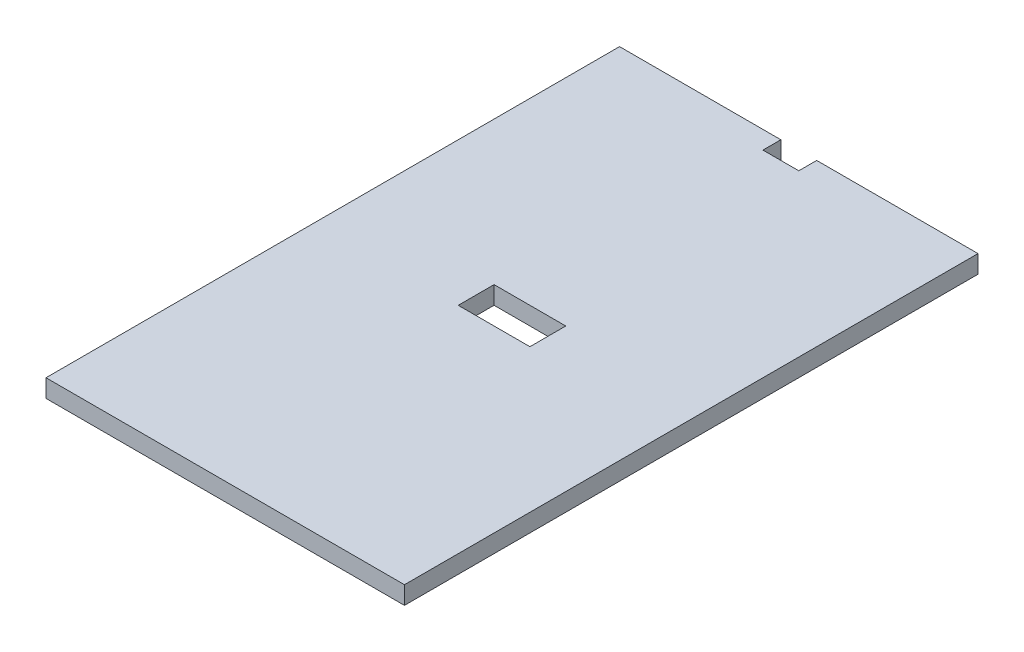
ISO-10303-21;
HEADER;
FILE_DESCRIPTION(('STEP AP214'),'2;1');
FILE_NAME('part.step','',(''),(''),'','','');
FILE_SCHEMA(('AUTOMOTIVE_DESIGN { 1 0 10303 214 1 1 1 1 }'));
ENDSEC;
DATA;
#1=APPLICATION_CONTEXT('core data for automotive mechanical design processes');
#2=APPLICATION_PROTOCOL_DEFINITION('international standard','automotive_design',2000,#1);
#3=PRODUCT_CONTEXT('',#1,'mechanical');
#4=PRODUCT('Part','Part','',(#3));
#5=PRODUCT_RELATED_PRODUCT_CATEGORY('part','',(#4));
#6=PRODUCT_DEFINITION_FORMATION('','',#4);
#7=PRODUCT_DEFINITION_CONTEXT('part definition',#1,'design');
#8=PRODUCT_DEFINITION('design','',#6,#7);
#9=PRODUCT_DEFINITION_SHAPE('','',#8);
#10=(LENGTH_UNIT() NAMED_UNIT(*) SI_UNIT(.MILLI.,.METRE.));
#11=(NAMED_UNIT(*) PLANE_ANGLE_UNIT() SI_UNIT($,.RADIAN.));
#12=(NAMED_UNIT(*) SI_UNIT($,.STERADIAN.) SOLID_ANGLE_UNIT());
#13=UNCERTAINTY_MEASURE_WITH_UNIT(LENGTH_MEASURE(1.E-05),#10,'distance_accuracy_value','');
#14=(GEOMETRIC_REPRESENTATION_CONTEXT(3) GLOBAL_UNCERTAINTY_ASSIGNED_CONTEXT((#13)) GLOBAL_UNIT_ASSIGNED_CONTEXT((#10,
#11,#12)) REPRESENTATION_CONTEXT('',''));
#15=CARTESIAN_POINT('',(0.,0.,0.));
#16=DIRECTION('',(0.,0.,1.));
#17=DIRECTION('',(1.,0.,0.));
#18=AXIS2_PLACEMENT_3D('',#15,#16,#17);
#19=CARTESIAN_POINT('',(50.,5.,-80.));
#20=DIRECTION('',(0.,0.,1.));
#21=DIRECTION('',(1.,0.,0.));
#22=AXIS2_PLACEMENT_3D('',#19,#20,#21);
#23=PLANE('',#22);
#24=DIRECTION('',(-1.,0.,0.));
#25=VECTOR('',#24,1.);
#26=CARTESIAN_POINT('',(50.,5.,-80.));
#27=LINE('',#26,#25);
#28=CARTESIAN_POINT('',(-5.,5.,-80.));
#29=VERTEX_POINT('',#28);
#30=CARTESIAN_POINT('',(-50.,5.,-80.));
#31=VERTEX_POINT('',#30);
#32=EDGE_CURVE('E197',#29,#31,#27,.T.);
#33=ORIENTED_EDGE('',*,*,#32,.F.);
#34=DIRECTION('',(0.,1.,0.));
#35=VECTOR('',#34,1.);
#36=CARTESIAN_POINT('',(-5.,0.,-80.));
#37=LINE('',#36,#35);
#38=CARTESIAN_POINT('',(-5.,0.,-80.));
#39=VERTEX_POINT('',#38);
#40=EDGE_CURVE('E154',#39,#29,#37,.T.);
#41=ORIENTED_EDGE('',*,*,#40,.F.);
#42=DIRECTION('',(-1.,0.,0.));
#43=VECTOR('',#42,1.);
#44=CARTESIAN_POINT('',(50.,0.,-80.));
#45=LINE('',#44,#43);
#46=CARTESIAN_POINT('',(-50.,0.,-80.));
#47=VERTEX_POINT('',#46);
#48=EDGE_CURVE('E146',#39,#47,#45,.T.);
#49=ORIENTED_EDGE('',*,*,#48,.T.);
#50=DIRECTION('',(0.,-1.,0.));
#51=VECTOR('',#50,1.);
#52=CARTESIAN_POINT('',(-50.,5.,-80.));
#53=LINE('',#52,#51);
#54=EDGE_CURVE('E201',#31,#47,#53,.T.);
#55=ORIENTED_EDGE('',*,*,#54,.F.);
#56=EDGE_LOOP('',(#33,#41,#49,#55));
#57=FACE_BOUND('',#56,.T.);
#58=ADVANCED_FACE('F33',(#57),#23,.F.);
#59=CARTESIAN_POINT('',(0.,5.,0.));
#60=DIRECTION('',(0.,-1.,0.));
#61=DIRECTION('',(0.,0.,-1.));
#62=AXIS2_PLACEMENT_3D('',#59,#60,#61);
#63=PLANE('',#62);
#64=DIRECTION('',(1.,0.,0.));
#65=VECTOR('',#64,1.);
#66=CARTESIAN_POINT('',(-5.,5.,-75.));
#67=LINE('',#66,#65);
#68=CARTESIAN_POINT('',(-5.,5.,-75.));
#69=VERTEX_POINT('',#68);
#70=CARTESIAN_POINT('',(5.,5.,-75.));
#71=VERTEX_POINT('',#70);
#72=EDGE_CURVE('E148',#69,#71,#67,.T.);
#73=ORIENTED_EDGE('',*,*,#72,.F.);
#74=DIRECTION('',(0.,0.,1.));
#75=VECTOR('',#74,1.);
#76=CARTESIAN_POINT('',(-5.,5.,-80.));
#77=LINE('',#76,#75);
#78=EDGE_CURVE('E128',#29,#69,#77,.T.);
#79=ORIENTED_EDGE('',*,*,#78,.F.);
#80=ORIENTED_EDGE('',*,*,#32,.T.);
#81=DIRECTION('',(0.,0.,1.));
#82=VECTOR('',#81,1.);
#83=CARTESIAN_POINT('',(-50.,5.,-80.));
#84=LINE('',#83,#82);
#85=CARTESIAN_POINT('',(-50.,5.,80.));
#86=VERTEX_POINT('',#85);
#87=EDGE_CURVE('E189',#31,#86,#84,.T.);
#88=ORIENTED_EDGE('',*,*,#87,.T.);
#89=DIRECTION('',(1.,0.,0.));
#90=VECTOR('',#89,1.);
#91=CARTESIAN_POINT('',(50.,5.,80.));
#92=LINE('',#91,#90);
#93=CARTESIAN_POINT('',(50.,5.,80.));
#94=VERTEX_POINT('',#93);
#95=EDGE_CURVE('E192',#86,#94,#92,.T.);
#96=ORIENTED_EDGE('',*,*,#95,.T.);
#97=DIRECTION('',(0.,0.,-1.));
#98=VECTOR('',#97,1.);
#99=CARTESIAN_POINT('',(50.,5.,-80.));
#100=LINE('',#99,#98);
#101=CARTESIAN_POINT('',(50.,5.,-80.));
#102=VERTEX_POINT('',#101);
#103=EDGE_CURVE('E195',#94,#102,#100,.T.);
#104=ORIENTED_EDGE('',*,*,#103,.T.);
#105=CARTESIAN_POINT('',(5.,5.,-80.));
#106=VERTEX_POINT('',#105);
#107=EDGE_CURVE('E198',#102,#106,#27,.T.);
#108=ORIENTED_EDGE('',*,*,#107,.T.);
#109=DIRECTION('',(0.,0.,-1.));
#110=VECTOR('',#109,1.);
#111=CARTESIAN_POINT('',(5.,5.,-80.));
#112=LINE('',#111,#110);
#113=EDGE_CURVE('E48',#71,#106,#112,.T.);
#114=ORIENTED_EDGE('',*,*,#113,.F.);
#115=EDGE_LOOP('',(#73,#79,#80,#88,#96,#104,#108,#114));
#116=FACE_BOUND('',#115,.T.);
#117=DIRECTION('',(0.,0.,-1.));
#118=VECTOR('',#117,1.);
#119=CARTESIAN_POINT('',(10.,5.,5.00000000000002));
#120=LINE('',#119,#118);
#121=CARTESIAN_POINT('',(10.,5.,5.00000000000002));
#122=VERTEX_POINT('',#121);
#123=CARTESIAN_POINT('',(10.,5.,-4.99999999999998));
#124=VERTEX_POINT('',#123);
#125=EDGE_CURVE('E160',#122,#124,#120,.T.);
#126=ORIENTED_EDGE('',*,*,#125,.F.);
#127=DIRECTION('',(1.,0.,0.));
#128=VECTOR('',#127,1.);
#129=CARTESIAN_POINT('',(-10.,5.,5.00000000000002));
#130=LINE('',#129,#128);
#131=CARTESIAN_POINT('',(-10.,5.,5.00000000000002));
#132=VERTEX_POINT('',#131);
#133=EDGE_CURVE('E167',#132,#122,#130,.T.);
#134=ORIENTED_EDGE('',*,*,#133,.F.);
#135=DIRECTION('',(0.,0.,1.));
#136=VECTOR('',#135,1.);
#137=CARTESIAN_POINT('',(-10.,5.,5.00000000000002));
#138=LINE('',#137,#136);
#139=CARTESIAN_POINT('',(-10.,5.,-4.99999999999998));
#140=VERTEX_POINT('',#139);
#141=EDGE_CURVE('E165',#140,#132,#138,.T.);
#142=ORIENTED_EDGE('',*,*,#141,.F.);
#143=DIRECTION('',(-1.,0.,0.));
#144=VECTOR('',#143,1.);
#145=CARTESIAN_POINT('',(-10.,5.,-4.99999999999998));
#146=LINE('',#145,#144);
#147=EDGE_CURVE('E162',#124,#140,#146,.T.);
#148=ORIENTED_EDGE('',*,*,#147,.F.);
#149=EDGE_LOOP('',(#126,#134,#142,#148));
#150=FACE_BOUND('',#149,.T.);
#151=ADVANCED_FACE('F227',(#116,#150),#63,.F.);
#152=CARTESIAN_POINT('',(0.,0.,0.));
#153=DIRECTION('',(0.,-1.,0.));
#154=DIRECTION('',(0.,0.,-1.));
#155=AXIS2_PLACEMENT_3D('',#152,#153,#154);
#156=PLANE('',#155);
#157=DIRECTION('',(0.,0.,1.));
#158=VECTOR('',#157,1.);
#159=CARTESIAN_POINT('',(-5.,0.,-80.));
#160=LINE('',#159,#158);
#161=CARTESIAN_POINT('',(-5.,0.,-75.));
#162=VERTEX_POINT('',#161);
#163=EDGE_CURVE('E125',#39,#162,#160,.T.);
#164=ORIENTED_EDGE('',*,*,#163,.T.);
#165=DIRECTION('',(1.,0.,0.));
#166=VECTOR('',#165,1.);
#167=CARTESIAN_POINT('',(-5.,0.,-75.));
#168=LINE('',#167,#166);
#169=CARTESIAN_POINT('',(5.,0.,-75.));
#170=VERTEX_POINT('',#169);
#171=EDGE_CURVE('E136',#162,#170,#168,.T.);
#172=ORIENTED_EDGE('',*,*,#171,.T.);
#173=DIRECTION('',(0.,0.,-1.));
#174=VECTOR('',#173,1.);
#175=CARTESIAN_POINT('',(5.,0.,-80.));
#176=LINE('',#175,#174);
#177=CARTESIAN_POINT('',(5.,0.,-80.));
#178=VERTEX_POINT('',#177);
#179=EDGE_CURVE('E133',#170,#178,#176,.T.);
#180=ORIENTED_EDGE('',*,*,#179,.T.);
#181=CARTESIAN_POINT('',(50.,0.,-80.));
#182=VERTEX_POINT('',#181);
#183=EDGE_CURVE('E193',#182,#178,#45,.T.);
#184=ORIENTED_EDGE('',*,*,#183,.F.);
#185=DIRECTION('',(0.,0.,-1.));
#186=VECTOR('',#185,1.);
#187=CARTESIAN_POINT('',(50.,0.,-80.));
#188=LINE('',#187,#186);
#189=CARTESIAN_POINT('',(50.,0.,80.));
#190=VERTEX_POINT('',#189);
#191=EDGE_CURVE('E206',#190,#182,#188,.T.);
#192=ORIENTED_EDGE('',*,*,#191,.F.);
#193=DIRECTION('',(1.,0.,0.));
#194=VECTOR('',#193,1.);
#195=CARTESIAN_POINT('',(50.,0.,80.));
#196=LINE('',#195,#194);
#197=CARTESIAN_POINT('',(-50.,0.,80.));
#198=VERTEX_POINT('',#197);
#199=EDGE_CURVE('E204',#198,#190,#196,.T.);
#200=ORIENTED_EDGE('',*,*,#199,.F.);
#201=DIRECTION('',(0.,0.,1.));
#202=VECTOR('',#201,1.);
#203=CARTESIAN_POINT('',(-50.,0.,-80.));
#204=LINE('',#203,#202);
#205=EDGE_CURVE('E188',#47,#198,#204,.T.);
#206=ORIENTED_EDGE('',*,*,#205,.F.);
#207=ORIENTED_EDGE('',*,*,#48,.F.);
#208=EDGE_LOOP('',(#164,#172,#180,#184,#192,#200,#206,#207));
#209=FACE_BOUND('',#208,.T.);
#210=DIRECTION('',(1.,0.,0.));
#211=VECTOR('',#210,1.);
#212=CARTESIAN_POINT('',(-10.,0.,5.00000000000002));
#213=LINE('',#212,#211);
#214=CARTESIAN_POINT('',(-10.,0.,5.00000000000002));
#215=VERTEX_POINT('',#214);
#216=CARTESIAN_POINT('',(10.,0.,5.00000000000002));
#217=VERTEX_POINT('',#216);
#218=EDGE_CURVE('E163',#215,#217,#213,.T.);
#219=ORIENTED_EDGE('',*,*,#218,.T.);
#220=DIRECTION('',(0.,0.,-1.));
#221=VECTOR('',#220,1.);
#222=CARTESIAN_POINT('',(10.,0.,5.00000000000002));
#223=LINE('',#222,#221);
#224=CARTESIAN_POINT('',(10.,0.,-4.99999999999998));
#225=VERTEX_POINT('',#224);
#226=EDGE_CURVE('E156',#217,#225,#223,.T.);
#227=ORIENTED_EDGE('',*,*,#226,.T.);
#228=DIRECTION('',(-1.,0.,0.));
#229=VECTOR('',#228,1.);
#230=CARTESIAN_POINT('',(-10.,0.,-4.99999999999998));
#231=LINE('',#230,#229);
#232=CARTESIAN_POINT('',(-10.,0.,-4.99999999999998));
#233=VERTEX_POINT('',#232);
#234=EDGE_CURVE('E172',#225,#233,#231,.T.);
#235=ORIENTED_EDGE('',*,*,#234,.T.);
#236=DIRECTION('',(0.,0.,1.));
#237=VECTOR('',#236,1.);
#238=CARTESIAN_POINT('',(-10.,0.,5.00000000000002));
#239=LINE('',#238,#237);
#240=EDGE_CURVE('E175',#233,#215,#239,.T.);
#241=ORIENTED_EDGE('',*,*,#240,.T.);
#242=EDGE_LOOP('',(#219,#227,#235,#241));
#243=FACE_BOUND('',#242,.T.);
#244=ADVANCED_FACE('F143',(#209,#243),#156,.T.);
#245=CARTESIAN_POINT('',(-50.,5.,-80.));
#246=DIRECTION('',(1.,0.,0.));
#247=DIRECTION('',(0.,0.,-1.));
#248=AXIS2_PLACEMENT_3D('',#245,#246,#247);
#249=PLANE('',#248);
#250=ORIENTED_EDGE('',*,*,#205,.T.);
#251=DIRECTION('',(0.,-1.,0.));
#252=VECTOR('',#251,1.);
#253=CARTESIAN_POINT('',(-50.,5.,80.));
#254=LINE('',#253,#252);
#255=EDGE_CURVE('E11',#86,#198,#254,.T.);
#256=ORIENTED_EDGE('',*,*,#255,.F.);
#257=ORIENTED_EDGE('',*,*,#87,.F.);
#258=ORIENTED_EDGE('',*,*,#54,.T.);
#259=EDGE_LOOP('',(#250,#256,#257,#258));
#260=FACE_BOUND('',#259,.T.);
#261=ADVANCED_FACE('F35',(#260),#249,.F.);
#262=CARTESIAN_POINT('',(50.,5.,80.));
#263=DIRECTION('',(0.,0.,-1.));
#264=DIRECTION('',(-1.,0.,0.));
#265=AXIS2_PLACEMENT_3D('',#262,#263,#264);
#266=PLANE('',#265);
#267=ORIENTED_EDGE('',*,*,#199,.T.);
#268=DIRECTION('',(0.,-1.,0.));
#269=VECTOR('',#268,1.);
#270=CARTESIAN_POINT('',(50.,5.,80.));
#271=LINE('',#270,#269);
#272=EDGE_CURVE('E41',#94,#190,#271,.T.);
#273=ORIENTED_EDGE('',*,*,#272,.F.);
#274=ORIENTED_EDGE('',*,*,#95,.F.);
#275=ORIENTED_EDGE('',*,*,#255,.T.);
#276=EDGE_LOOP('',(#267,#273,#274,#275));
#277=FACE_BOUND('',#276,.T.);
#278=ADVANCED_FACE('F231',(#277),#266,.F.);
#279=CARTESIAN_POINT('',(50.,5.,-80.));
#280=DIRECTION('',(-1.,0.,0.));
#281=DIRECTION('',(0.,0.,1.));
#282=AXIS2_PLACEMENT_3D('',#279,#280,#281);
#283=PLANE('',#282);
#284=ORIENTED_EDGE('',*,*,#191,.T.);
#285=DIRECTION('',(0.,-1.,0.));
#286=VECTOR('',#285,1.);
#287=CARTESIAN_POINT('',(50.,5.,-80.));
#288=LINE('',#287,#286);
#289=EDGE_CURVE('E212',#102,#182,#288,.T.);
#290=ORIENTED_EDGE('',*,*,#289,.F.);
#291=ORIENTED_EDGE('',*,*,#103,.F.);
#292=ORIENTED_EDGE('',*,*,#272,.T.);
#293=EDGE_LOOP('',(#284,#290,#291,#292));
#294=FACE_BOUND('',#293,.T.);
#295=ADVANCED_FACE('F219',(#294),#283,.F.);
#296=ORIENTED_EDGE('',*,*,#183,.T.);
#297=DIRECTION('',(0.,1.,0.));
#298=VECTOR('',#297,1.);
#299=CARTESIAN_POINT('',(5.,0.,-80.));
#300=LINE('',#299,#298);
#301=EDGE_CURVE('E157',#178,#106,#300,.T.);
#302=ORIENTED_EDGE('',*,*,#301,.T.);
#303=ORIENTED_EDGE('',*,*,#107,.F.);
#304=ORIENTED_EDGE('',*,*,#289,.T.);
#305=EDGE_LOOP('',(#296,#302,#303,#304));
#306=FACE_BOUND('',#305,.T.);
#307=ADVANCED_FACE('F224',(#306),#23,.F.);
#308=CARTESIAN_POINT('',(10.,5.,5.00000000000002));
#309=DIRECTION('',(-1.,0.,0.));
#310=DIRECTION('',(0.,0.,1.));
#311=AXIS2_PLACEMENT_3D('',#308,#309,#310);
#312=PLANE('',#311);
#313=ORIENTED_EDGE('',*,*,#226,.F.);
#314=DIRECTION('',(0.,-1.,0.));
#315=VECTOR('',#314,1.);
#316=CARTESIAN_POINT('',(10.,5.,5.00000000000002));
#317=LINE('',#316,#315);
#318=EDGE_CURVE('E169',#122,#217,#317,.T.);
#319=ORIENTED_EDGE('',*,*,#318,.F.);
#320=ORIENTED_EDGE('',*,*,#125,.T.);
#321=DIRECTION('',(0.,-1.,0.));
#322=VECTOR('',#321,1.);
#323=CARTESIAN_POINT('',(10.,5.,-4.99999999999998));
#324=LINE('',#323,#322);
#325=EDGE_CURVE('E185',#124,#225,#324,.T.);
#326=ORIENTED_EDGE('',*,*,#325,.T.);
#327=EDGE_LOOP('',(#313,#319,#320,#326));
#328=FACE_BOUND('',#327,.T.);
#329=ADVANCED_FACE('F246',(#328),#312,.T.);
#330=CARTESIAN_POINT('',(-10.,5.,-4.99999999999998));
#331=DIRECTION('',(0.,0.,1.));
#332=DIRECTION('',(1.,0.,0.));
#333=AXIS2_PLACEMENT_3D('',#330,#331,#332);
#334=PLANE('',#333);
#335=ORIENTED_EDGE('',*,*,#234,.F.);
#336=ORIENTED_EDGE('',*,*,#325,.F.);
#337=ORIENTED_EDGE('',*,*,#147,.T.);
#338=DIRECTION('',(0.,-1.,0.));
#339=VECTOR('',#338,1.);
#340=CARTESIAN_POINT('',(-10.,5.,-4.99999999999998));
#341=LINE('',#340,#339);
#342=EDGE_CURVE('E183',#140,#233,#341,.T.);
#343=ORIENTED_EDGE('',*,*,#342,.T.);
#344=EDGE_LOOP('',(#335,#336,#337,#343));
#345=FACE_BOUND('',#344,.T.);
#346=ADVANCED_FACE('F252',(#345),#334,.T.);
#347=CARTESIAN_POINT('',(-10.,5.,5.00000000000002));
#348=DIRECTION('',(1.,0.,0.));
#349=DIRECTION('',(0.,0.,-1.));
#350=AXIS2_PLACEMENT_3D('',#347,#348,#349);
#351=PLANE('',#350);
#352=ORIENTED_EDGE('',*,*,#240,.F.);
#353=ORIENTED_EDGE('',*,*,#342,.F.);
#354=ORIENTED_EDGE('',*,*,#141,.T.);
#355=DIRECTION('',(0.,-1.,0.));
#356=VECTOR('',#355,1.);
#357=CARTESIAN_POINT('',(-10.,5.,5.00000000000002));
#358=LINE('',#357,#356);
#359=EDGE_CURVE('E56',#132,#215,#358,.T.);
#360=ORIENTED_EDGE('',*,*,#359,.T.);
#361=EDGE_LOOP('',(#352,#353,#354,#360));
#362=FACE_BOUND('',#361,.T.);
#363=ADVANCED_FACE('F269',(#362),#351,.T.);
#364=CARTESIAN_POINT('',(-10.,5.,5.00000000000002));
#365=DIRECTION('',(0.,0.,-1.));
#366=DIRECTION('',(-1.,0.,0.));
#367=AXIS2_PLACEMENT_3D('',#364,#365,#366);
#368=PLANE('',#367);
#369=ORIENTED_EDGE('',*,*,#218,.F.);
#370=ORIENTED_EDGE('',*,*,#359,.F.);
#371=ORIENTED_EDGE('',*,*,#133,.T.);
#372=ORIENTED_EDGE('',*,*,#318,.T.);
#373=EDGE_LOOP('',(#369,#370,#371,#372));
#374=FACE_BOUND('',#373,.T.);
#375=ADVANCED_FACE('F273',(#374),#368,.T.);
#376=CARTESIAN_POINT('',(-5.,0.,-80.));
#377=DIRECTION('',(-1.,0.,0.));
#378=DIRECTION('',(0.,0.,1.));
#379=AXIS2_PLACEMENT_3D('',#376,#377,#378);
#380=PLANE('',#379);
#381=ORIENTED_EDGE('',*,*,#78,.T.);
#382=DIRECTION('',(0.,1.,0.));
#383=VECTOR('',#382,1.);
#384=CARTESIAN_POINT('',(-5.,0.,-75.));
#385=LINE('',#384,#383);
#386=EDGE_CURVE('E121',#162,#69,#385,.T.);
#387=ORIENTED_EDGE('',*,*,#386,.F.);
#388=ORIENTED_EDGE('',*,*,#163,.F.);
#389=ORIENTED_EDGE('',*,*,#40,.T.);
#390=EDGE_LOOP('',(#381,#387,#388,#389));
#391=FACE_BOUND('',#390,.T.);
#392=ADVANCED_FACE('F123',(#391),#380,.F.);
#393=CARTESIAN_POINT('',(5.,0.,-80.));
#394=DIRECTION('',(1.,0.,0.));
#395=DIRECTION('',(0.,0.,-1.));
#396=AXIS2_PLACEMENT_3D('',#393,#394,#395);
#397=PLANE('',#396);
#398=ORIENTED_EDGE('',*,*,#113,.T.);
#399=ORIENTED_EDGE('',*,*,#301,.F.);
#400=ORIENTED_EDGE('',*,*,#179,.F.);
#401=DIRECTION('',(0.,1.,0.));
#402=VECTOR('',#401,1.);
#403=CARTESIAN_POINT('',(5.,0.,-75.));
#404=LINE('',#403,#402);
#405=EDGE_CURVE('E132',#170,#71,#404,.T.);
#406=ORIENTED_EDGE('',*,*,#405,.T.);
#407=EDGE_LOOP('',(#398,#399,#400,#406));
#408=FACE_BOUND('',#407,.T.);
#409=ADVANCED_FACE('F279',(#408),#397,.F.);
#410=CARTESIAN_POINT('',(-5.,0.,-75.));
#411=DIRECTION('',(0.,0.,1.));
#412=DIRECTION('',(1.,0.,0.));
#413=AXIS2_PLACEMENT_3D('',#410,#411,#412);
#414=PLANE('',#413);
#415=ORIENTED_EDGE('',*,*,#72,.T.);
#416=ORIENTED_EDGE('',*,*,#405,.F.);
#417=ORIENTED_EDGE('',*,*,#171,.F.);
#418=ORIENTED_EDGE('',*,*,#386,.T.);
#419=EDGE_LOOP('',(#415,#416,#417,#418));
#420=FACE_BOUND('',#419,.T.);
#421=ADVANCED_FACE('F137',(#420),#414,.F.);
#422=CLOSED_SHELL('',(#58,#151,#244,#261,#278,#295,#307,#329,#346,#363,#375,#392,#409,#421));
#423=MANIFOLD_SOLID_BREP('B2',#422);
#424=ADVANCED_BREP_SHAPE_REPRESENTATION('',(#18,#423),#14);
#425=SHAPE_DEFINITION_REPRESENTATION(#9,#424);
ENDSEC;
END-ISO-10303-21;
